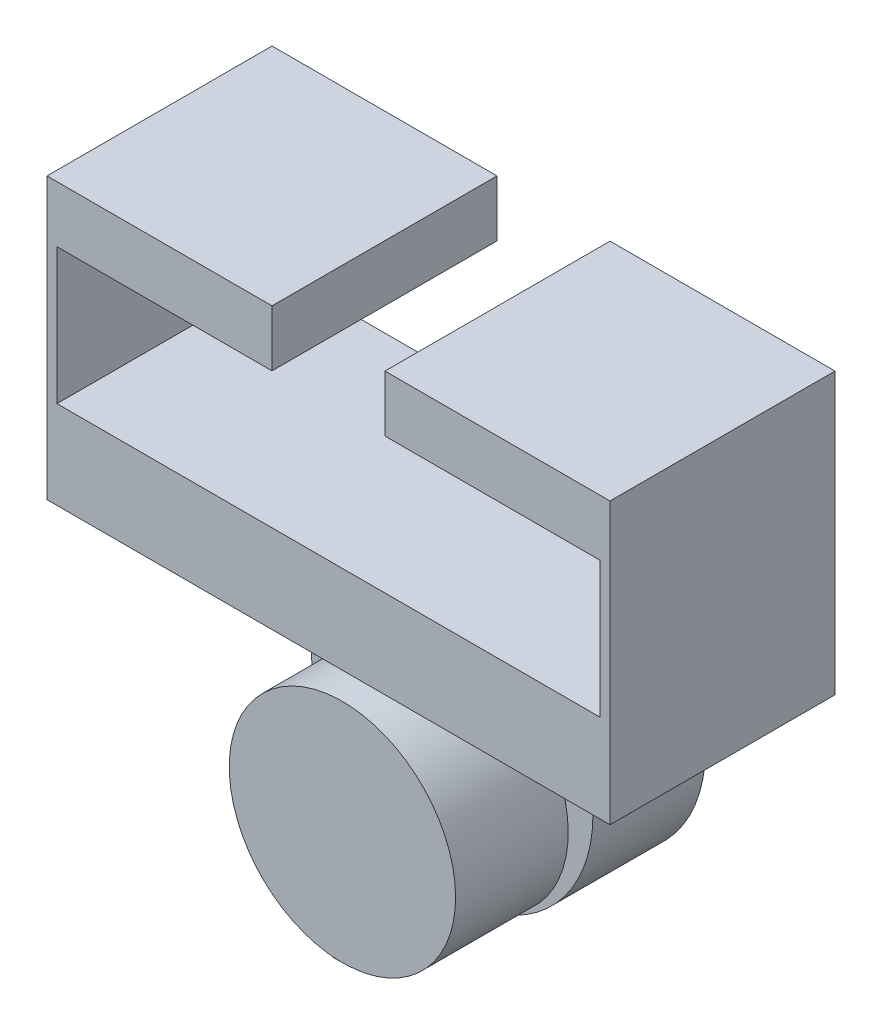
ISO-10303-21;
HEADER;
FILE_DESCRIPTION(('STEP AP214'),'2;1');
FILE_NAME('part.step','',(''),(''),'','','');
FILE_SCHEMA(('AUTOMOTIVE_DESIGN { 1 0 10303 214 1 1 1 1 }'));
ENDSEC;
DATA;
#1=APPLICATION_CONTEXT('core data for automotive mechanical design processes');
#2=APPLICATION_PROTOCOL_DEFINITION('international standard','automotive_design',2000,#1);
#3=PRODUCT_CONTEXT('',#1,'mechanical');
#4=PRODUCT('Part','Part','',(#3));
#5=PRODUCT_RELATED_PRODUCT_CATEGORY('part','',(#4));
#6=PRODUCT_DEFINITION_FORMATION('','',#4);
#7=PRODUCT_DEFINITION_CONTEXT('part definition',#1,'design');
#8=PRODUCT_DEFINITION('design','',#6,#7);
#9=PRODUCT_DEFINITION_SHAPE('','',#8);
#10=(LENGTH_UNIT() NAMED_UNIT(*) SI_UNIT(.MILLI.,.METRE.));
#11=(NAMED_UNIT(*) PLANE_ANGLE_UNIT() SI_UNIT($,.RADIAN.));
#12=(NAMED_UNIT(*) SI_UNIT($,.STERADIAN.) SOLID_ANGLE_UNIT());
#13=UNCERTAINTY_MEASURE_WITH_UNIT(LENGTH_MEASURE(1.E-05),#10,'distance_accuracy_value','');
#14=(GEOMETRIC_REPRESENTATION_CONTEXT(3) GLOBAL_UNCERTAINTY_ASSIGNED_CONTEXT((#13)) GLOBAL_UNIT_ASSIGNED_CONTEXT((#10,
#11,#12)) REPRESENTATION_CONTEXT('',''));
#15=CARTESIAN_POINT('',(0.,0.,0.));
#16=DIRECTION('',(0.,0.,1.));
#17=DIRECTION('',(1.,0.,0.));
#18=AXIS2_PLACEMENT_3D('',#15,#16,#17);
#19=CARTESIAN_POINT('',(-1.25075757575756,-12.7,25.37968));
#20=DIRECTION('',(0.,0.,-1.));
#21=DIRECTION('',(-1.,0.,0.));
#22=AXIS2_PLACEMENT_3D('',#19,#20,#21);
#23=CYLINDRICAL_SURFACE('',#22,15.875);
#24=CARTESIAN_POINT('',(-2.02441893334144,-28.5561367647918,12.67968));
#25=DIRECTION('',(0.999908740176695,-0.0135096749870101,0.));
#26=VECTOR('',#25,1.);
#27=LINE('',#24,#26);
#28=CARTESIAN_POINT('',(-2.02441893334144,-28.5561367647918,12.67968));
#29=VERTEX_POINT('',#28);
#30=CARTESIAN_POINT('',(-1.27461716882641,-28.5706247080041,12.67968));
#31=VERTEX_POINT('',#30);
#32=EDGE_CURVE('E12',#29,#31,#27,.T.);
#33=ORIENTED_EDGE('',*,*,#32,.F.);
#34=CARTESIAN_POINT('',(-1.25075757575756,-12.7,12.67968));
#35=DIRECTION('',(0.,0.,1.));
#36=DIRECTION('',(1.,0.,0.));
#37=AXIS2_PLACEMENT_3D('',#34,#35,#36);
#38=CIRCLE('',#37,15.875);
#39=CARTESIAN_POINT('',(-17.1257575757576,-12.7,12.67968));
#40=VERTEX_POINT('',#39);
#41=EDGE_CURVE('E70',#40,#29,#38,.T.);
#42=ORIENTED_EDGE('',*,*,#41,.F.);
#43=DIRECTION('',(0.,0.,-1.));
#44=VECTOR('',#43,1.);
#45=CARTESIAN_POINT('',(-17.1257575757576,-12.7,25.37968));
#46=LINE('',#45,#44);
#47=CARTESIAN_POINT('',(-17.1257575757576,-12.7,0.));
#48=VERTEX_POINT('',#47);
#49=EDGE_CURVE('E227',#40,#48,#46,.T.);
#50=ORIENTED_EDGE('',*,*,#49,.T.);
#51=CARTESIAN_POINT('',(-1.25075757575756,-12.7,0.));
#52=DIRECTION('',(0.,0.,1.));
#53=DIRECTION('',(1.,0.,0.));
#54=AXIS2_PLACEMENT_3D('',#51,#52,#53);
#55=CIRCLE('',#54,15.875);
#56=CARTESIAN_POINT('',(14.6242424242424,-12.7,0.));
#57=VERTEX_POINT('',#56);
#58=EDGE_CURVE('E231',#48,#57,#55,.T.);
#59=ORIENTED_EDGE('',*,*,#58,.T.);
#60=DIRECTION('',(0.,0.,-1.));
#61=VECTOR('',#60,1.);
#62=CARTESIAN_POINT('',(14.6242424242424,-12.7,25.37968));
#63=LINE('',#62,#61);
#64=CARTESIAN_POINT('',(14.6242424242424,-12.7,12.67968));
#65=VERTEX_POINT('',#64);
#66=EDGE_CURVE('E235',#65,#57,#63,.T.);
#67=ORIENTED_EDGE('',*,*,#66,.F.);
#68=CARTESIAN_POINT('',(-1.25075757575756,-12.7,12.67968));
#69=DIRECTION('',(0.,0.,1.));
#70=DIRECTION('',(1.,0.,0.));
#71=AXIS2_PLACEMENT_3D('',#68,#69,#70);
#72=CIRCLE('',#71,15.875);
#73=CARTESIAN_POINT('',(1.6408524997439,-28.3094271570503,12.67968));
#74=VERTEX_POINT('',#73);
#75=EDGE_CURVE('E95',#74,#65,#72,.T.);
#76=ORIENTED_EDGE('',*,*,#75,.F.);
#77=DIRECTION('',(0.,0.,1.));
#78=VECTOR('',#77,1.);
#79=CARTESIAN_POINT('',(1.6408524997439,-28.3094271570503,12.67968));
#80=LINE('',#79,#78);
#81=CARTESIAN_POINT('',(1.6408524997439,-28.3094271570503,25.37968));
#82=VERTEX_POINT('',#81);
#83=EDGE_CURVE('E228',#74,#82,#80,.T.);
#84=ORIENTED_EDGE('',*,*,#83,.T.);
#85=CARTESIAN_POINT('',(-1.25075757575756,-12.7,25.37968));
#86=DIRECTION('',(0.,0.,1.));
#87=DIRECTION('',(1.,0.,0.));
#88=AXIS2_PLACEMENT_3D('',#85,#86,#87);
#89=CIRCLE('',#88,15.875);
#90=CARTESIAN_POINT('',(-1.27461716882641,-28.5706247080041,25.37968));
#91=VERTEX_POINT('',#90);
#92=EDGE_CURVE('E213',#91,#82,#89,.T.);
#93=ORIENTED_EDGE('',*,*,#92,.F.);
#94=CARTESIAN_POINT('',(-1.27461061806684,-28.5662673559497,12.67968));
#95=DIRECTION('',(0.,0.,1.));
#96=VECTOR('',#95,1.);
#97=LINE('',#94,#96);
#98=EDGE_CURVE('E102',#31,#91,#97,.T.);
#99=ORIENTED_EDGE('',*,*,#98,.F.);
#100=EDGE_LOOP('',(#33,#42,#50,#59,#67,#76,#84,#93,#99));
#101=FACE_BOUND('',#100,.T.);
#102=ADVANCED_FACE('F60',(#101),#23,.T.);
#103=CARTESIAN_POINT('',(-17.1257575757576,0.,25.37968));
#104=DIRECTION('',(1.,0.,0.));
#105=DIRECTION('',(0.,1.,0.));
#106=AXIS2_PLACEMENT_3D('',#103,#104,#105);
#107=PLANE('',#106);
#108=DIRECTION('',(0.,-1.,0.));
#109=VECTOR('',#108,1.);
#110=CARTESIAN_POINT('',(-17.1257575757576,0.,12.67968));
#111=LINE('',#110,#109);
#112=CARTESIAN_POINT('',(-17.1257575757576,0.,12.67968));
#113=VERTEX_POINT('',#112);
#114=EDGE_CURVE('E313',#113,#40,#111,.T.);
#115=ORIENTED_EDGE('',*,*,#114,.F.);
#116=DIRECTION('',(0.,0.,-1.));
#117=VECTOR('',#116,1.);
#118=CARTESIAN_POINT('',(-17.1257575757576,0.,25.37968));
#119=LINE('',#118,#117);
#120=CARTESIAN_POINT('',(-17.1257575757576,0.,0.));
#121=VERTEX_POINT('',#120);
#122=EDGE_CURVE('E224',#113,#121,#119,.T.);
#123=ORIENTED_EDGE('',*,*,#122,.T.);
#124=DIRECTION('',(0.,-1.,0.));
#125=VECTOR('',#124,1.);
#126=CARTESIAN_POINT('',(-17.1257575757576,0.,0.));
#127=LINE('',#126,#125);
#128=EDGE_CURVE('E230',#121,#48,#127,.T.);
#129=ORIENTED_EDGE('',*,*,#128,.T.);
#130=ORIENTED_EDGE('',*,*,#49,.F.);
#131=EDGE_LOOP('',(#115,#123,#129,#130));
#132=FACE_BOUND('',#131,.T.);
#133=ADVANCED_FACE('F349',(#132),#107,.F.);
#134=CARTESIAN_POINT('',(14.6242424242424,0.,25.37968));
#135=DIRECTION('',(-1.,0.,0.));
#136=DIRECTION('',(0.,-1.,0.));
#137=AXIS2_PLACEMENT_3D('',#134,#135,#136);
#138=PLANE('',#137);
#139=DIRECTION('',(0.,1.,0.));
#140=VECTOR('',#139,1.);
#141=CARTESIAN_POINT('',(14.6242424242424,0.,12.67968));
#142=LINE('',#141,#140);
#143=CARTESIAN_POINT('',(14.6242424242424,0.,12.67968));
#144=VERTEX_POINT('',#143);
#145=EDGE_CURVE('E325',#65,#144,#142,.T.);
#146=ORIENTED_EDGE('',*,*,#145,.F.);
#147=ORIENTED_EDGE('',*,*,#66,.T.);
#148=DIRECTION('',(0.,1.,0.));
#149=VECTOR('',#148,1.);
#150=CARTESIAN_POINT('',(14.6242424242424,0.,0.));
#151=LINE('',#150,#149);
#152=CARTESIAN_POINT('',(14.6242424242424,0.,0.));
#153=VERTEX_POINT('',#152);
#154=EDGE_CURVE('E205',#57,#153,#151,.T.);
#155=ORIENTED_EDGE('',*,*,#154,.T.);
#156=DIRECTION('',(0.,0.,-1.));
#157=VECTOR('',#156,1.);
#158=CARTESIAN_POINT('',(14.6242424242424,0.,25.37968));
#159=LINE('',#158,#157);
#160=EDGE_CURVE('E219',#144,#153,#159,.T.);
#161=ORIENTED_EDGE('',*,*,#160,.F.);
#162=EDGE_LOOP('',(#146,#147,#155,#161));
#163=FACE_BOUND('',#162,.T.);
#164=ADVANCED_FACE('F377',(#163),#138,.F.);
#165=CARTESIAN_POINT('',(0.,0.,25.37968));
#166=DIRECTION('',(0.,0.,1.));
#167=DIRECTION('',(1.,0.,0.));
#168=AXIS2_PLACEMENT_3D('',#165,#166,#167);
#169=PLANE('',#168);
#170=DIRECTION('',(1.,0.,0.));
#171=VECTOR('',#170,1.);
#172=CARTESIAN_POINT('',(0.,0.,25.37968));
#173=LINE('',#172,#171);
#174=CARTESIAN_POINT('',(-34.2515151515151,0.,25.37968));
#175=VERTEX_POINT('',#174);
#176=CARTESIAN_POINT('',(29.2484848484849,0.,25.37968));
#177=VERTEX_POINT('',#176);
#178=EDGE_CURVE('E189',#175,#177,#173,.T.);
#179=ORIENTED_EDGE('',*,*,#178,.T.);
#180=DIRECTION('',(0.,1.,0.));
#181=VECTOR('',#180,1.);
#182=CARTESIAN_POINT('',(29.2484848484849,0.,25.37968));
#183=LINE('',#182,#181);
#184=CARTESIAN_POINT('',(29.2484848484849,31.6217171717172,25.37968));
#185=VERTEX_POINT('',#184);
#186=EDGE_CURVE('E202',#177,#185,#183,.T.);
#187=ORIENTED_EDGE('',*,*,#186,.T.);
#188=DIRECTION('',(-1.,0.,0.));
#189=VECTOR('',#188,1.);
#190=CARTESIAN_POINT('',(0.,31.6217171717172,25.37968));
#191=LINE('',#190,#189);
#192=CARTESIAN_POINT('',(3.86880484848488,31.6217171717172,25.37968));
#193=VERTEX_POINT('',#192);
#194=EDGE_CURVE('E306',#185,#193,#191,.T.);
#195=ORIENTED_EDGE('',*,*,#194,.T.);
#196=DIRECTION('',(0.,-1.,0.));
#197=VECTOR('',#196,1.);
#198=CARTESIAN_POINT('',(3.86880484848487,0.,25.37968));
#199=LINE('',#198,#197);
#200=CARTESIAN_POINT('',(3.86880484848488,25.2717171717172,25.37968));
#201=VERTEX_POINT('',#200);
#202=EDGE_CURVE('E308',#193,#201,#199,.T.);
#203=ORIENTED_EDGE('',*,*,#202,.T.);
#204=DIRECTION('',(1.,0.,0.));
#205=VECTOR('',#204,1.);
#206=CARTESIAN_POINT('',(0.,25.2717171717172,25.37968));
#207=LINE('',#206,#205);
#208=CARTESIAN_POINT('',(28.1207248484849,25.2717171717172,25.37968));
#209=VERTEX_POINT('',#208);
#210=EDGE_CURVE('E305',#201,#209,#207,.T.);
#211=ORIENTED_EDGE('',*,*,#210,.T.);
#212=DIRECTION('',(0.,-1.,0.));
#213=VECTOR('',#212,1.);
#214=CARTESIAN_POINT('',(28.1207248484849,0.,25.37968));
#215=LINE('',#214,#213);
#216=CARTESIAN_POINT('',(28.1207248484849,9.9419191919192,25.37968));
#217=VERTEX_POINT('',#216);
#218=EDGE_CURVE('E302',#209,#217,#215,.T.);
#219=ORIENTED_EDGE('',*,*,#218,.T.);
#220=DIRECTION('',(-1.,0.,0.));
#221=VECTOR('',#220,1.);
#222=CARTESIAN_POINT('',(0.,9.94191919191919,25.37968));
#223=LINE('',#222,#221);
#224=CARTESIAN_POINT('',(-33.1237551515151,9.94191919191919,25.37968));
#225=VERTEX_POINT('',#224);
#226=EDGE_CURVE('E298',#217,#225,#223,.T.);
#227=ORIENTED_EDGE('',*,*,#226,.T.);
#228=DIRECTION('',(0.,1.,0.));
#229=VECTOR('',#228,1.);
#230=CARTESIAN_POINT('',(-33.1237551515151,0.,25.37968));
#231=LINE('',#230,#229);
#232=CARTESIAN_POINT('',(-33.1237551515151,25.2717171717172,25.37968));
#233=VERTEX_POINT('',#232);
#234=EDGE_CURVE('E300',#225,#233,#231,.T.);
#235=ORIENTED_EDGE('',*,*,#234,.T.);
#236=DIRECTION('',(1.,0.,0.));
#237=VECTOR('',#236,1.);
#238=CARTESIAN_POINT('',(0.,25.2717171717172,25.37968));
#239=LINE('',#238,#237);
#240=CARTESIAN_POINT('',(-8.87183515151513,25.2717171717172,25.37968));
#241=VERTEX_POINT('',#240);
#242=EDGE_CURVE('E297',#233,#241,#239,.T.);
#243=ORIENTED_EDGE('',*,*,#242,.T.);
#244=DIRECTION('',(0.,1.,0.));
#245=VECTOR('',#244,1.);
#246=CARTESIAN_POINT('',(-8.8718351515151,0.,25.37968));
#247=LINE('',#246,#245);
#248=CARTESIAN_POINT('',(-8.87183515151514,31.6217171717172,25.37968));
#249=VERTEX_POINT('',#248);
#250=EDGE_CURVE('E294',#241,#249,#247,.T.);
#251=ORIENTED_EDGE('',*,*,#250,.T.);
#252=DIRECTION('',(-1.,0.,0.));
#253=VECTOR('',#252,1.);
#254=CARTESIAN_POINT('',(0.,31.6217171717172,25.37968));
#255=LINE('',#254,#253);
#256=CARTESIAN_POINT('',(-34.2515151515151,31.6217171717172,25.37968));
#257=VERTEX_POINT('',#256);
#258=EDGE_CURVE('E209',#249,#257,#255,.T.);
#259=ORIENTED_EDGE('',*,*,#258,.T.);
#260=DIRECTION('',(0.,-1.,0.));
#261=VECTOR('',#260,1.);
#262=CARTESIAN_POINT('',(-34.2515151515151,0.,25.37968));
#263=LINE('',#262,#261);
#264=EDGE_CURVE('E203',#257,#175,#263,.T.);
#265=ORIENTED_EDGE('',*,*,#264,.T.);
#266=EDGE_LOOP('',(#179,#187,#195,#203,#211,#219,#227,#235,#243,#251,#259,#265));
#267=FACE_BOUND('',#266,.T.);
#268=ADVANCED_FACE('F56',(#267),#169,.T.);
#269=ORIENTED_EDGE('',*,*,#92,.T.);
#270=CARTESIAN_POINT('',(-0.929730400272846,-15.8055682965875,25.37968));
#271=DIRECTION('',(0.,0.,1.));
#272=DIRECTION('',(1.,0.,0.));
#273=AXIS2_PLACEMENT_3D('',#270,#271,#272);
#274=CIRCLE('',#273,12.7653587042524);
#275=EDGE_CURVE('E295',#82,#91,#274,.T.);
#276=ORIENTED_EDGE('',*,*,#275,.T.);
#277=EDGE_LOOP('',(#269,#276));
#278=FACE_BOUND('',#277,.T.);
#279=ADVANCED_FACE('F368',(#278),#169,.T.);
#280=CARTESIAN_POINT('',(-34.2515151515151,0.,25.37968));
#281=DIRECTION('',(1.,0.,0.));
#282=DIRECTION('',(0.,0.,-1.));
#283=AXIS2_PLACEMENT_3D('',#280,#281,#282);
#284=PLANE('',#283);
#285=DIRECTION('',(0.,-1.,0.));
#286=VECTOR('',#285,1.);
#287=CARTESIAN_POINT('',(-34.2515151515151,0.,0.));
#288=LINE('',#287,#286);
#289=CARTESIAN_POINT('',(-34.2515151515151,31.6217171717172,0.));
#290=VERTEX_POINT('',#289);
#291=CARTESIAN_POINT('',(-34.2515151515151,0.,0.));
#292=VERTEX_POINT('',#291);
#293=EDGE_CURVE('E214',#290,#292,#288,.T.);
#294=ORIENTED_EDGE('',*,*,#293,.T.);
#295=DIRECTION('',(0.,0.,-1.));
#296=VECTOR('',#295,1.);
#297=CARTESIAN_POINT('',(-34.2515151515151,0.,25.37968));
#298=LINE('',#297,#296);
#299=EDGE_CURVE('E193',#175,#292,#298,.T.);
#300=ORIENTED_EDGE('',*,*,#299,.F.);
#301=ORIENTED_EDGE('',*,*,#264,.F.);
#302=DIRECTION('',(0.,0.,-1.));
#303=VECTOR('',#302,1.);
#304=CARTESIAN_POINT('',(-34.2515151515151,31.6217171717172,25.37968));
#305=LINE('',#304,#303);
#306=EDGE_CURVE('E221',#257,#290,#305,.T.);
#307=ORIENTED_EDGE('',*,*,#306,.T.);
#308=EDGE_LOOP('',(#294,#300,#301,#307));
#309=FACE_BOUND('',#308,.T.);
#310=ADVANCED_FACE('F211',(#309),#284,.F.);
#311=CARTESIAN_POINT('',(0.,0.,25.37968));
#312=DIRECTION('',(0.,1.,0.));
#313=DIRECTION('',(0.,0.,1.));
#314=AXIS2_PLACEMENT_3D('',#311,#312,#313);
#315=PLANE('',#314);
#316=DIRECTION('',(1.,0.,0.));
#317=VECTOR('',#316,1.);
#318=CARTESIAN_POINT('',(0.,0.,0.));
#319=LINE('',#318,#317);
#320=EDGE_CURVE('E220',#292,#121,#319,.T.);
#321=ORIENTED_EDGE('',*,*,#320,.T.);
#322=ORIENTED_EDGE('',*,*,#122,.F.);
#323=DIRECTION('',(1.,0.,0.));
#324=VECTOR('',#323,1.);
#325=CARTESIAN_POINT('',(0.,0.,12.67968));
#326=LINE('',#325,#324);
#327=EDGE_CURVE('E273',#113,#144,#326,.T.);
#328=ORIENTED_EDGE('',*,*,#327,.T.);
#329=ORIENTED_EDGE('',*,*,#160,.T.);
#330=CARTESIAN_POINT('',(29.2484848484849,0.,0.));
#331=VERTEX_POINT('',#330);
#332=EDGE_CURVE('E218',#153,#331,#319,.T.);
#333=ORIENTED_EDGE('',*,*,#332,.T.);
#334=DIRECTION('',(0.,0.,-1.));
#335=VECTOR('',#334,1.);
#336=CARTESIAN_POINT('',(29.2484848484849,0.,25.37968));
#337=LINE('',#336,#335);
#338=EDGE_CURVE('E200',#177,#331,#337,.T.);
#339=ORIENTED_EDGE('',*,*,#338,.F.);
#340=ORIENTED_EDGE('',*,*,#178,.F.);
#341=ORIENTED_EDGE('',*,*,#299,.T.);
#342=EDGE_LOOP('',(#321,#322,#328,#329,#333,#339,#340,#341));
#343=FACE_BOUND('',#342,.T.);
#344=ADVANCED_FACE('F194',(#343),#315,.F.);
#345=CARTESIAN_POINT('',(29.2484848484849,0.,25.37968));
#346=DIRECTION('',(-1.,0.,0.));
#347=DIRECTION('',(0.,0.,1.));
#348=AXIS2_PLACEMENT_3D('',#345,#346,#347);
#349=PLANE('',#348);
#350=DIRECTION('',(0.,1.,0.));
#351=VECTOR('',#350,1.);
#352=CARTESIAN_POINT('',(29.2484848484849,0.,0.));
#353=LINE('',#352,#351);
#354=CARTESIAN_POINT('',(29.2484848484849,31.6217171717172,0.));
#355=VERTEX_POINT('',#354);
#356=EDGE_CURVE('E234',#331,#355,#353,.T.);
#357=ORIENTED_EDGE('',*,*,#356,.T.);
#358=DIRECTION('',(0.,0.,-1.));
#359=VECTOR('',#358,1.);
#360=CARTESIAN_POINT('',(29.2484848484849,31.6217171717172,25.37968));
#361=LINE('',#360,#359);
#362=EDGE_CURVE('E239',#185,#355,#361,.T.);
#363=ORIENTED_EDGE('',*,*,#362,.F.);
#364=ORIENTED_EDGE('',*,*,#186,.F.);
#365=ORIENTED_EDGE('',*,*,#338,.T.);
#366=EDGE_LOOP('',(#357,#363,#364,#365));
#367=FACE_BOUND('',#366,.T.);
#368=ADVANCED_FACE('F390',(#367),#349,.F.);
#369=CARTESIAN_POINT('',(0.,31.6217171717172,25.37968));
#370=DIRECTION('',(0.,-1.,0.));
#371=DIRECTION('',(1.,0.,0.));
#372=AXIS2_PLACEMENT_3D('',#369,#370,#371);
#373=PLANE('',#372);
#374=DIRECTION('',(-1.,0.,0.));
#375=VECTOR('',#374,1.);
#376=CARTESIAN_POINT('',(0.,31.6217171717172,0.));
#377=LINE('',#376,#375);
#378=CARTESIAN_POINT('',(3.86880484848488,31.6217171717172,0.));
#379=VERTEX_POINT('',#378);
#380=EDGE_CURVE('E240',#355,#379,#377,.T.);
#381=ORIENTED_EDGE('',*,*,#380,.T.);
#382=DIRECTION('',(0.,0.,-1.));
#383=VECTOR('',#382,1.);
#384=CARTESIAN_POINT('',(3.86880484848488,31.6217171717172,25.37968));
#385=LINE('',#384,#383);
#386=EDGE_CURVE('E244',#193,#379,#385,.T.);
#387=ORIENTED_EDGE('',*,*,#386,.F.);
#388=ORIENTED_EDGE('',*,*,#194,.F.);
#389=ORIENTED_EDGE('',*,*,#362,.T.);
#390=EDGE_LOOP('',(#381,#387,#388,#389));
#391=FACE_BOUND('',#390,.T.);
#392=ADVANCED_FACE('F394',(#391),#373,.F.);
#393=CARTESIAN_POINT('',(3.86880484848487,0.,25.37968));
#394=DIRECTION('',(1.,0.,0.));
#395=DIRECTION('',(0.,1.,0.));
#396=AXIS2_PLACEMENT_3D('',#393,#394,#395);
#397=PLANE('',#396);
#398=DIRECTION('',(0.,-1.,0.));
#399=VECTOR('',#398,1.);
#400=CARTESIAN_POINT('',(3.86880484848487,0.,0.));
#401=LINE('',#400,#399);
#402=CARTESIAN_POINT('',(3.86880484848488,25.2717171717172,0.));
#403=VERTEX_POINT('',#402);
#404=EDGE_CURVE('E242',#379,#403,#401,.T.);
#405=ORIENTED_EDGE('',*,*,#404,.T.);
#406=DIRECTION('',(0.,0.,-1.));
#407=VECTOR('',#406,1.);
#408=CARTESIAN_POINT('',(3.86880484848488,25.2717171717172,25.37968));
#409=LINE('',#408,#407);
#410=EDGE_CURVE('E247',#201,#403,#409,.T.);
#411=ORIENTED_EDGE('',*,*,#410,.F.);
#412=ORIENTED_EDGE('',*,*,#202,.F.);
#413=ORIENTED_EDGE('',*,*,#386,.T.);
#414=EDGE_LOOP('',(#405,#411,#412,#413));
#415=FACE_BOUND('',#414,.T.);
#416=ADVANCED_FACE('F396',(#415),#397,.F.);
#417=CARTESIAN_POINT('',(0.,25.2717171717172,25.37968));
#418=DIRECTION('',(0.,1.,0.));
#419=DIRECTION('',(0.,0.,1.));
#420=AXIS2_PLACEMENT_3D('',#417,#418,#419);
#421=PLANE('',#420);
#422=DIRECTION('',(1.,0.,0.));
#423=VECTOR('',#422,1.);
#424=CARTESIAN_POINT('',(0.,25.2717171717172,0.));
#425=LINE('',#424,#423);
#426=CARTESIAN_POINT('',(28.1207248484849,25.2717171717172,0.));
#427=VERTEX_POINT('',#426);
#428=EDGE_CURVE('E243',#403,#427,#425,.T.);
#429=ORIENTED_EDGE('',*,*,#428,.T.);
#430=DIRECTION('',(0.,0.,-1.));
#431=VECTOR('',#430,1.);
#432=CARTESIAN_POINT('',(28.1207248484849,25.2717171717172,25.37968));
#433=LINE('',#432,#431);
#434=EDGE_CURVE('E248',#209,#427,#433,.T.);
#435=ORIENTED_EDGE('',*,*,#434,.F.);
#436=ORIENTED_EDGE('',*,*,#210,.F.);
#437=ORIENTED_EDGE('',*,*,#410,.T.);
#438=EDGE_LOOP('',(#429,#435,#436,#437));
#439=FACE_BOUND('',#438,.T.);
#440=ADVANCED_FACE('F403',(#439),#421,.F.);
#441=CARTESIAN_POINT('',(28.1207248484849,0.,25.37968));
#442=DIRECTION('',(1.,0.,0.));
#443=DIRECTION('',(0.,1.,0.));
#444=AXIS2_PLACEMENT_3D('',#441,#442,#443);
#445=PLANE('',#444);
#446=DIRECTION('',(0.,-1.,0.));
#447=VECTOR('',#446,1.);
#448=CARTESIAN_POINT('',(28.1207248484849,0.,0.));
#449=LINE('',#448,#447);
#450=CARTESIAN_POINT('',(28.1207248484849,9.9419191919192,0.));
#451=VERTEX_POINT('',#450);
#452=EDGE_CURVE('E249',#427,#451,#449,.T.);
#453=ORIENTED_EDGE('',*,*,#452,.T.);
#454=DIRECTION('',(0.,0.,-1.));
#455=VECTOR('',#454,1.);
#456=CARTESIAN_POINT('',(28.1207248484849,9.9419191919192,25.37968));
#457=LINE('',#456,#455);
#458=EDGE_CURVE('E251',#217,#451,#457,.T.);
#459=ORIENTED_EDGE('',*,*,#458,.F.);
#460=ORIENTED_EDGE('',*,*,#218,.F.);
#461=ORIENTED_EDGE('',*,*,#434,.T.);
#462=EDGE_LOOP('',(#453,#459,#460,#461));
#463=FACE_BOUND('',#462,.T.);
#464=ADVANCED_FACE('F407',(#463),#445,.F.);
#465=CARTESIAN_POINT('',(0.,9.94191919191919,25.37968));
#466=DIRECTION('',(0.,-1.,0.));
#467=DIRECTION('',(1.,0.,0.));
#468=AXIS2_PLACEMENT_3D('',#465,#466,#467);
#469=PLANE('',#468);
#470=DIRECTION('',(-1.,0.,0.));
#471=VECTOR('',#470,1.);
#472=CARTESIAN_POINT('',(0.,9.94191919191919,0.));
#473=LINE('',#472,#471);
#474=CARTESIAN_POINT('',(-33.1237551515151,9.94191919191919,0.));
#475=VERTEX_POINT('',#474);
#476=EDGE_CURVE('E255',#451,#475,#473,.T.);
#477=ORIENTED_EDGE('',*,*,#476,.T.);
#478=DIRECTION('',(0.,0.,-1.));
#479=VECTOR('',#478,1.);
#480=CARTESIAN_POINT('',(-33.1237551515151,9.94191919191919,25.37968));
#481=LINE('',#480,#479);
#482=EDGE_CURVE('E256',#225,#475,#481,.T.);
#483=ORIENTED_EDGE('',*,*,#482,.F.);
#484=ORIENTED_EDGE('',*,*,#226,.F.);
#485=ORIENTED_EDGE('',*,*,#458,.T.);
#486=EDGE_LOOP('',(#477,#483,#484,#485));
#487=FACE_BOUND('',#486,.T.);
#488=ADVANCED_FACE('F412',(#487),#469,.F.);
#489=CARTESIAN_POINT('',(-33.1237551515151,0.,25.37968));
#490=DIRECTION('',(-1.,0.,0.));
#491=DIRECTION('',(0.,-1.,0.));
#492=AXIS2_PLACEMENT_3D('',#489,#490,#491);
#493=PLANE('',#492);
#494=DIRECTION('',(0.,1.,0.));
#495=VECTOR('',#494,1.);
#496=CARTESIAN_POINT('',(-33.1237551515151,0.,0.));
#497=LINE('',#496,#495);
#498=CARTESIAN_POINT('',(-33.1237551515151,25.2717171717172,0.));
#499=VERTEX_POINT('',#498);
#500=EDGE_CURVE('E257',#475,#499,#497,.T.);
#501=ORIENTED_EDGE('',*,*,#500,.T.);
#502=DIRECTION('',(0.,0.,-1.));
#503=VECTOR('',#502,1.);
#504=CARTESIAN_POINT('',(-33.1237551515151,25.2717171717172,25.37968));
#505=LINE('',#504,#503);
#506=EDGE_CURVE('E265',#233,#499,#505,.T.);
#507=ORIENTED_EDGE('',*,*,#506,.F.);
#508=ORIENTED_EDGE('',*,*,#234,.F.);
#509=ORIENTED_EDGE('',*,*,#482,.T.);
#510=EDGE_LOOP('',(#501,#507,#508,#509));
#511=FACE_BOUND('',#510,.T.);
#512=ADVANCED_FACE('F419',(#511),#493,.F.);
#513=CARTESIAN_POINT('',(0.,25.2717171717172,25.37968));
#514=DIRECTION('',(0.,1.,0.));
#515=DIRECTION('',(0.,0.,1.));
#516=AXIS2_PLACEMENT_3D('',#513,#514,#515);
#517=PLANE('',#516);
#518=DIRECTION('',(1.,0.,0.));
#519=VECTOR('',#518,1.);
#520=CARTESIAN_POINT('',(0.,25.2717171717172,0.));
#521=LINE('',#520,#519);
#522=CARTESIAN_POINT('',(-8.87183515151513,25.2717171717172,0.));
#523=VERTEX_POINT('',#522);
#524=EDGE_CURVE('E263',#499,#523,#521,.T.);
#525=ORIENTED_EDGE('',*,*,#524,.T.);
#526=DIRECTION('',(0.,0.,-1.));
#527=VECTOR('',#526,1.);
#528=CARTESIAN_POINT('',(-8.87183515151513,25.2717171717172,25.37968));
#529=LINE('',#528,#527);
#530=EDGE_CURVE('E266',#241,#523,#529,.T.);
#531=ORIENTED_EDGE('',*,*,#530,.F.);
#532=ORIENTED_EDGE('',*,*,#242,.F.);
#533=ORIENTED_EDGE('',*,*,#506,.T.);
#534=EDGE_LOOP('',(#525,#531,#532,#533));
#535=FACE_BOUND('',#534,.T.);
#536=ADVANCED_FACE('F421',(#535),#517,.F.);
#537=CARTESIAN_POINT('',(-8.8718351515151,0.,25.37968));
#538=DIRECTION('',(-1.,0.,0.));
#539=DIRECTION('',(0.,-1.,0.));
#540=AXIS2_PLACEMENT_3D('',#537,#538,#539);
#541=PLANE('',#540);
#542=DIRECTION('',(0.,1.,0.));
#543=VECTOR('',#542,1.);
#544=CARTESIAN_POINT('',(-8.8718351515151,0.,0.));
#545=LINE('',#544,#543);
#546=CARTESIAN_POINT('',(-8.87183515151514,31.6217171717172,0.));
#547=VERTEX_POINT('',#546);
#548=EDGE_CURVE('E262',#523,#547,#545,.T.);
#549=ORIENTED_EDGE('',*,*,#548,.T.);
#550=DIRECTION('',(0.,0.,-1.));
#551=VECTOR('',#550,1.);
#552=CARTESIAN_POINT('',(-8.87183515151514,31.6217171717172,25.37968));
#553=LINE('',#552,#551);
#554=EDGE_CURVE('E269',#249,#547,#553,.T.);
#555=ORIENTED_EDGE('',*,*,#554,.F.);
#556=ORIENTED_EDGE('',*,*,#250,.F.);
#557=ORIENTED_EDGE('',*,*,#530,.T.);
#558=EDGE_LOOP('',(#549,#555,#556,#557));
#559=FACE_BOUND('',#558,.T.);
#560=ADVANCED_FACE('F426',(#559),#541,.F.);
#561=CARTESIAN_POINT('',(0.,31.6217171717172,25.37968));
#562=DIRECTION('',(0.,-1.,0.));
#563=DIRECTION('',(0.,0.,-1.));
#564=AXIS2_PLACEMENT_3D('',#561,#562,#563);
#565=PLANE('',#564);
#566=DIRECTION('',(-1.,0.,0.));
#567=VECTOR('',#566,1.);
#568=CARTESIAN_POINT('',(0.,31.6217171717172,0.));
#569=LINE('',#568,#567);
#570=EDGE_CURVE('E267',#547,#290,#569,.T.);
#571=ORIENTED_EDGE('',*,*,#570,.T.);
#572=ORIENTED_EDGE('',*,*,#306,.F.);
#573=ORIENTED_EDGE('',*,*,#258,.F.);
#574=ORIENTED_EDGE('',*,*,#554,.T.);
#575=EDGE_LOOP('',(#571,#572,#573,#574));
#576=FACE_BOUND('',#575,.T.);
#577=ADVANCED_FACE('F432',(#576),#565,.F.);
#578=CARTESIAN_POINT('',(0.,0.,0.));
#579=DIRECTION('',(0.,0.,1.));
#580=DIRECTION('',(1.,0.,0.));
#581=AXIS2_PLACEMENT_3D('',#578,#579,#580);
#582=PLANE('',#581);
#583=ORIENTED_EDGE('',*,*,#293,.F.);
#584=ORIENTED_EDGE('',*,*,#570,.F.);
#585=ORIENTED_EDGE('',*,*,#548,.F.);
#586=ORIENTED_EDGE('',*,*,#524,.F.);
#587=ORIENTED_EDGE('',*,*,#500,.F.);
#588=ORIENTED_EDGE('',*,*,#476,.F.);
#589=ORIENTED_EDGE('',*,*,#452,.F.);
#590=ORIENTED_EDGE('',*,*,#428,.F.);
#591=ORIENTED_EDGE('',*,*,#404,.F.);
#592=ORIENTED_EDGE('',*,*,#380,.F.);
#593=ORIENTED_EDGE('',*,*,#356,.F.);
#594=ORIENTED_EDGE('',*,*,#332,.F.);
#595=ORIENTED_EDGE('',*,*,#154,.F.);
#596=ORIENTED_EDGE('',*,*,#58,.F.);
#597=ORIENTED_EDGE('',*,*,#128,.F.);
#598=ORIENTED_EDGE('',*,*,#320,.F.);
#599=EDGE_LOOP('',(#583,#584,#585,#586,#587,#588,#589,#590,#591,#592,#593,#594,#595,#596,#597,#598));
#600=FACE_BOUND('',#599,.T.);
#601=ADVANCED_FACE('F341',(#600),#582,.F.);
#602=CARTESIAN_POINT('',(-0.929730400272846,-15.8055682965875,12.67968));
#603=DIRECTION('',(0.,0.,1.));
#604=DIRECTION('',(1.,0.,0.));
#605=AXIS2_PLACEMENT_3D('',#602,#603,#604);
#606=CYLINDRICAL_SURFACE('',#605,12.7653587042524);
#607=ORIENTED_EDGE('',*,*,#275,.F.);
#608=ORIENTED_EDGE('',*,*,#83,.F.);
#609=CARTESIAN_POINT('',(-0.929730400272846,-15.8055682965875,12.67968));
#610=DIRECTION('',(0.,0.,1.));
#611=DIRECTION('',(1.,0.,0.));
#612=AXIS2_PLACEMENT_3D('',#609,#610,#611);
#613=CIRCLE('',#612,12.7653587042524);
#614=EDGE_CURVE('E323',#74,#31,#613,.T.);
#615=ORIENTED_EDGE('',*,*,#614,.T.);
#616=ORIENTED_EDGE('',*,*,#98,.T.);
#617=EDGE_LOOP('',(#607,#608,#615,#616));
#618=FACE_BOUND('',#617,.T.);
#619=ADVANCED_FACE('F331',(#618),#606,.T.);
#620=CARTESIAN_POINT('',(0.,0.,12.67968));
#621=DIRECTION('',(0.,0.,1.));
#622=DIRECTION('',(1.,0.,0.));
#623=AXIS2_PLACEMENT_3D('',#620,#621,#622);
#624=PLANE('',#623);
#625=ORIENTED_EDGE('',*,*,#614,.F.);
#626=ORIENTED_EDGE('',*,*,#75,.T.);
#627=ORIENTED_EDGE('',*,*,#145,.T.);
#628=ORIENTED_EDGE('',*,*,#327,.F.);
#629=ORIENTED_EDGE('',*,*,#114,.T.);
#630=ORIENTED_EDGE('',*,*,#41,.T.);
#631=ORIENTED_EDGE('',*,*,#32,.T.);
#632=EDGE_LOOP('',(#625,#626,#627,#628,#629,#630,#631));
#633=FACE_BOUND('',#632,.T.);
#634=ADVANCED_FACE('F345',(#633),#624,.T.);
#635=CLOSED_SHELL('',(#102,#133,#164,#268,#279,#310,#344,#368,#392,#416,#440,#464,#488,#512,
#536,#560,#577,#601,#619,#634));
#636=MANIFOLD_SOLID_BREP('B2',#635);
#637=CARTESIAN_POINT('',(-1.25075757575756,-12.7,25.37968));
#638=DIRECTION('',(0.,0.,-1.));
#639=DIRECTION('',(-1.,0.,0.));
#640=AXIS2_PLACEMENT_3D('',#637,#638,#639);
#641=CYLINDRICAL_SURFACE('',#640,15.875);
#642=DIRECTION('',(0.,0.,1.));
#643=VECTOR('',#642,1.);
#644=CARTESIAN_POINT('',(-2.02441893334144,-28.5561367647918,12.67968));
#645=LINE('',#644,#643);
#646=CARTESIAN_POINT('',(-2.02441893334144,-28.5561367647918,12.67968));
#647=VERTEX_POINT('',#646);
#648=CARTESIAN_POINT('',(-2.02441893334144,-28.5561367647918,25.37968));
#649=VERTEX_POINT('',#648);
#650=EDGE_CURVE('E652',#647,#649,#645,.T.);
#651=ORIENTED_EDGE('',*,*,#650,.F.);
#652=CARTESIAN_POINT('',(-1.25075757575756,-12.7,12.67968));
#653=DIRECTION('',(0.,0.,1.));
#654=DIRECTION('',(-0.0487345737060714,-0.998811764711293,0.));
#655=AXIS2_PLACEMENT_3D('',#652,#653,#654);
#656=CIRCLE('',#655,15.875);
#657=CARTESIAN_POINT('',(-1.27461716882641,-28.5706247080041,12.67968));
#658=VERTEX_POINT('',#657);
#659=EDGE_CURVE('E639',#647,#658,#656,.T.);
#660=ORIENTED_EDGE('',*,*,#659,.T.);
#661=CARTESIAN_POINT('',(-1.27462371958599,-28.5749820600585,12.67968));
#662=DIRECTION('',(0.,0.,1.));
#663=VECTOR('',#662,1.);
#664=LINE('',#661,#663);
#665=CARTESIAN_POINT('',(-1.27461716882641,-28.5706247080041,25.37968));
#666=VERTEX_POINT('',#665);
#667=EDGE_CURVE('E635',#658,#666,#664,.T.);
#668=ORIENTED_EDGE('',*,*,#667,.T.);
#669=CARTESIAN_POINT('',(-1.25075757575756,-12.7,25.37968));
#670=DIRECTION('',(0.,0.,1.));
#671=DIRECTION('',(1.,0.,0.));
#672=AXIS2_PLACEMENT_3D('',#669,#670,#671);
#673=CIRCLE('',#672,15.875);
#674=EDGE_CURVE('E54',#649,#666,#673,.T.);
#675=ORIENTED_EDGE('',*,*,#674,.F.);
#676=EDGE_LOOP('',(#651,#660,#668,#675));
#677=FACE_BOUND('',#676,.T.);
#678=ADVANCED_FACE('F625',(#677),#641,.T.);
#679=CARTESIAN_POINT('',(0.,0.,25.37968));
#680=DIRECTION('',(0.,0.,1.));
#681=DIRECTION('',(1.,0.,0.));
#682=AXIS2_PLACEMENT_3D('',#679,#680,#681);
#683=PLANE('',#682);
#684=DIRECTION('',(0.999908740176695,-0.0135096749870073,0.));
#685=VECTOR('',#684,1.);
#686=CARTESIAN_POINT('',(-0.386118399353866,-28.5782716925666,25.37968));
#687=LINE('',#686,#685);
#688=EDGE_CURVE('E647',#649,#666,#687,.T.);
#689=ORIENTED_EDGE('',*,*,#688,.F.);
#690=ORIENTED_EDGE('',*,*,#674,.T.);
#691=EDGE_LOOP('',(#689,#690));
#692=FACE_BOUND('',#691,.T.);
#693=ADVANCED_FACE('F659',(#692),#683,.T.);
#694=CARTESIAN_POINT('',(-0.386118399353866,-28.5782716925666,12.67968));
#695=DIRECTION('',(-0.0135096749870073,-0.999908740176695,0.));
#696=DIRECTION('',(0.999908740176695,-0.0135096749870073,0.));
#697=AXIS2_PLACEMENT_3D('',#694,#695,#696);
#698=PLANE('',#697);
#699=ORIENTED_EDGE('',*,*,#688,.T.);
#700=ORIENTED_EDGE('',*,*,#667,.F.);
#701=ORIENTED_EDGE('',*,*,#659,.F.);
#702=ORIENTED_EDGE('',*,*,#650,.T.);
#703=EDGE_LOOP('',(#699,#700,#701,#702));
#704=FACE_BOUND('',#703,.T.);
#705=ADVANCED_FACE('F655',(#704),#698,.F.);
#706=CLOSED_SHELL('',(#678,#693,#705));
#707=MANIFOLD_SOLID_BREP('B6',#706);
#708=ADVANCED_BREP_SHAPE_REPRESENTATION('',(#18,#636,#707),#14);
#709=SHAPE_DEFINITION_REPRESENTATION(#9,#708);
ENDSEC;
END-ISO-10303-21;
